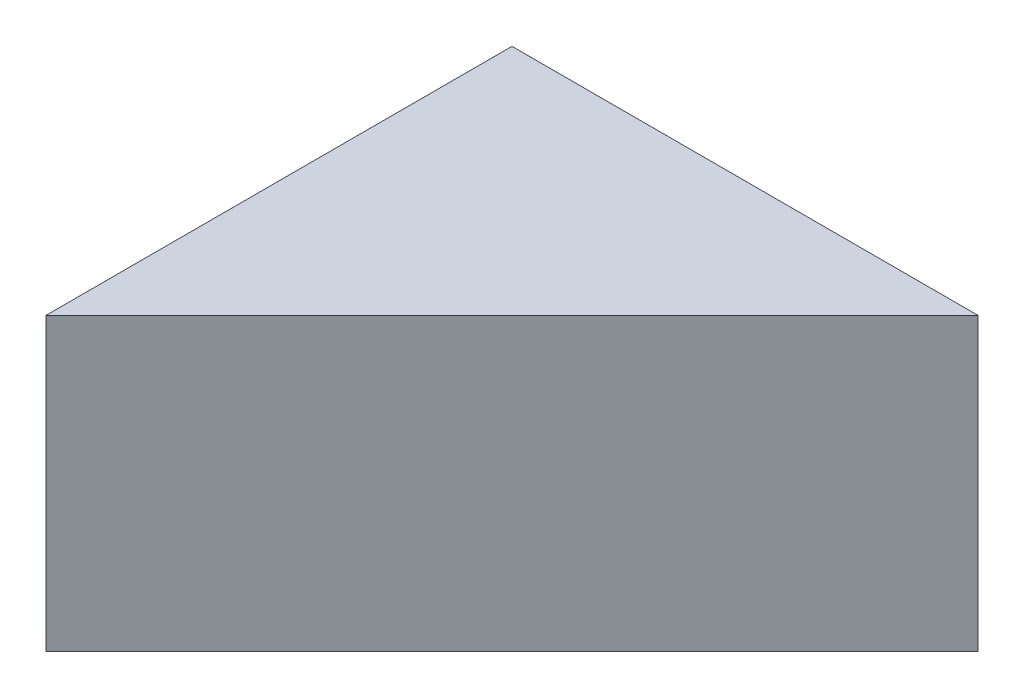
ISO-10303-21;
HEADER;
FILE_DESCRIPTION(('STEP AP214'),'2;1');
FILE_NAME('part.step','',(''),(''),'','','');
FILE_SCHEMA(('AUTOMOTIVE_DESIGN { 1 0 10303 214 1 1 1 1 }'));
ENDSEC;
DATA;
#1=APPLICATION_CONTEXT('core data for automotive mechanical design processes');
#2=APPLICATION_PROTOCOL_DEFINITION('international standard','automotive_design',2000,#1);
#3=PRODUCT_CONTEXT('',#1,'mechanical');
#4=PRODUCT('Part','Part','',(#3));
#5=PRODUCT_RELATED_PRODUCT_CATEGORY('part','',(#4));
#6=PRODUCT_DEFINITION_FORMATION('','',#4);
#7=PRODUCT_DEFINITION_CONTEXT('part definition',#1,'design');
#8=PRODUCT_DEFINITION('design','',#6,#7);
#9=PRODUCT_DEFINITION_SHAPE('','',#8);
#10=(LENGTH_UNIT() NAMED_UNIT(*) SI_UNIT(.MILLI.,.METRE.));
#11=(NAMED_UNIT(*) PLANE_ANGLE_UNIT() SI_UNIT($,.RADIAN.));
#12=(NAMED_UNIT(*) SI_UNIT($,.STERADIAN.) SOLID_ANGLE_UNIT());
#13=UNCERTAINTY_MEASURE_WITH_UNIT(LENGTH_MEASURE(1.E-05),#10,'distance_accuracy_value','');
#14=(GEOMETRIC_REPRESENTATION_CONTEXT(3) GLOBAL_UNCERTAINTY_ASSIGNED_CONTEXT((#13)) GLOBAL_UNIT_ASSIGNED_CONTEXT((#10,
#11,#12)) REPRESENTATION_CONTEXT('',''));
#15=CARTESIAN_POINT('',(0.,0.,0.));
#16=DIRECTION('',(0.,0.,1.));
#17=DIRECTION('',(1.,0.,0.));
#18=AXIS2_PLACEMENT_3D('',#15,#16,#17);
#19=CARTESIAN_POINT('',(0.,10.,-8.));
#20=DIRECTION('',(0.,0.,1.));
#21=DIRECTION('',(1.,0.,0.));
#22=AXIS2_PLACEMENT_3D('',#19,#20,#21);
#23=PLANE('',#22);
#24=DIRECTION('',(-1.,0.,0.));
#25=VECTOR('',#24,1.);
#26=CARTESIAN_POINT('',(0.,0.,-8.));
#27=LINE('',#26,#25);
#28=CARTESIAN_POINT('',(16.,0.,-8.));
#29=VERTEX_POINT('',#28);
#30=CARTESIAN_POINT('',(0.,0.,-8.));
#31=VERTEX_POINT('',#30);
#32=EDGE_CURVE('E80',#29,#31,#27,.T.);
#33=ORIENTED_EDGE('',*,*,#32,.T.);
#34=DIRECTION('',(0.,-1.,0.));
#35=VECTOR('',#34,1.);
#36=CARTESIAN_POINT('',(0.,10.,-8.));
#37=LINE('',#36,#35);
#38=CARTESIAN_POINT('',(0.,10.,-8.));
#39=VERTEX_POINT('',#38);
#40=EDGE_CURVE('E11',#39,#31,#37,.T.);
#41=ORIENTED_EDGE('',*,*,#40,.F.);
#42=DIRECTION('',(-1.,0.,0.));
#43=VECTOR('',#42,1.);
#44=CARTESIAN_POINT('',(0.,10.,-8.));
#45=LINE('',#44,#43);
#46=CARTESIAN_POINT('',(16.,10.,-8.));
#47=VERTEX_POINT('',#46);
#48=EDGE_CURVE('E73',#47,#39,#45,.T.);
#49=ORIENTED_EDGE('',*,*,#48,.F.);
#50=DIRECTION('',(0.,-1.,0.));
#51=VECTOR('',#50,1.);
#52=CARTESIAN_POINT('',(16.,10.,-8.));
#53=LINE('',#52,#51);
#54=EDGE_CURVE('E81',#47,#29,#53,.T.);
#55=ORIENTED_EDGE('',*,*,#54,.T.);
#56=EDGE_LOOP('',(#33,#41,#49,#55));
#57=FACE_BOUND('',#56,.T.);
#58=ADVANCED_FACE('F33',(#57),#23,.F.);
#59=CARTESIAN_POINT('',(0.,10.,8.));
#60=DIRECTION('',(1.,0.,0.));
#61=DIRECTION('',(0.,0.,-1.));
#62=AXIS2_PLACEMENT_3D('',#59,#60,#61);
#63=PLANE('',#62);
#64=DIRECTION('',(0.,0.,1.));
#65=VECTOR('',#64,1.);
#66=CARTESIAN_POINT('',(0.,0.,8.));
#67=LINE('',#66,#65);
#68=CARTESIAN_POINT('',(0.,0.,8.));
#69=VERTEX_POINT('',#68);
#70=EDGE_CURVE('E61',#31,#69,#67,.T.);
#71=ORIENTED_EDGE('',*,*,#70,.T.);
#72=DIRECTION('',(0.,-1.,0.));
#73=VECTOR('',#72,1.);
#74=CARTESIAN_POINT('',(0.,10.,8.));
#75=LINE('',#74,#73);
#76=CARTESIAN_POINT('',(0.,10.,8.));
#77=VERTEX_POINT('',#76);
#78=EDGE_CURVE('E41',#77,#69,#75,.T.);
#79=ORIENTED_EDGE('',*,*,#78,.F.);
#80=DIRECTION('',(0.,0.,1.));
#81=VECTOR('',#80,1.);
#82=CARTESIAN_POINT('',(0.,10.,8.));
#83=LINE('',#82,#81);
#84=EDGE_CURVE('E69',#39,#77,#83,.T.);
#85=ORIENTED_EDGE('',*,*,#84,.F.);
#86=ORIENTED_EDGE('',*,*,#40,.T.);
#87=EDGE_LOOP('',(#71,#79,#85,#86));
#88=FACE_BOUND('',#87,.T.);
#89=ADVANCED_FACE('F70',(#88),#63,.F.);
#90=CARTESIAN_POINT('',(16.,10.,-8.));
#91=DIRECTION('',(-0.707106781186548,0.,-0.707106781186548));
#92=DIRECTION('',(-0.707106781186548,0.,0.707106781186548));
#93=AXIS2_PLACEMENT_3D('',#90,#91,#92);
#94=PLANE('',#93);
#95=DIRECTION('',(0.707106781186548,0.,-0.707106781186548));
#96=VECTOR('',#95,1.);
#97=CARTESIAN_POINT('',(16.,0.,-8.));
#98=LINE('',#97,#96);
#99=EDGE_CURVE('E66',#69,#29,#98,.T.);
#100=ORIENTED_EDGE('',*,*,#99,.T.);
#101=ORIENTED_EDGE('',*,*,#54,.F.);
#102=DIRECTION('',(0.707106781186548,0.,-0.707106781186548));
#103=VECTOR('',#102,1.);
#104=CARTESIAN_POINT('',(16.,10.,-8.));
#105=LINE('',#104,#103);
#106=EDGE_CURVE('E49',#77,#47,#105,.T.);
#107=ORIENTED_EDGE('',*,*,#106,.F.);
#108=ORIENTED_EDGE('',*,*,#78,.T.);
#109=EDGE_LOOP('',(#100,#101,#107,#108));
#110=FACE_BOUND('',#109,.T.);
#111=ADVANCED_FACE('F88',(#110),#94,.F.);
#112=CARTESIAN_POINT('',(0.,10.,0.));
#113=DIRECTION('',(0.,1.,0.));
#114=DIRECTION('',(0.,0.,1.));
#115=AXIS2_PLACEMENT_3D('',#112,#113,#114);
#116=PLANE('',#115);
#117=ORIENTED_EDGE('',*,*,#48,.T.);
#118=ORIENTED_EDGE('',*,*,#84,.T.);
#119=ORIENTED_EDGE('',*,*,#106,.T.);
#120=EDGE_LOOP('',(#117,#118,#119));
#121=FACE_BOUND('',#120,.T.);
#122=ADVANCED_FACE('F76',(#121),#116,.T.);
#123=CARTESIAN_POINT('',(0.,0.,0.));
#124=DIRECTION('',(0.,1.,0.));
#125=DIRECTION('',(0.,0.,1.));
#126=AXIS2_PLACEMENT_3D('',#123,#124,#125);
#127=PLANE('',#126);
#128=ORIENTED_EDGE('',*,*,#32,.F.);
#129=ORIENTED_EDGE('',*,*,#99,.F.);
#130=ORIENTED_EDGE('',*,*,#70,.F.);
#131=EDGE_LOOP('',(#128,#129,#130));
#132=FACE_BOUND('',#131,.T.);
#133=ADVANCED_FACE('F89',(#132),#127,.F.);
#134=CLOSED_SHELL('',(#58,#89,#111,#122,#133));
#135=MANIFOLD_SOLID_BREP('B2',#134);
#136=ADVANCED_BREP_SHAPE_REPRESENTATION('',(#18,#135),#14);
#137=SHAPE_DEFINITION_REPRESENTATION(#9,#136);
ENDSEC;
END-ISO-10303-21;
